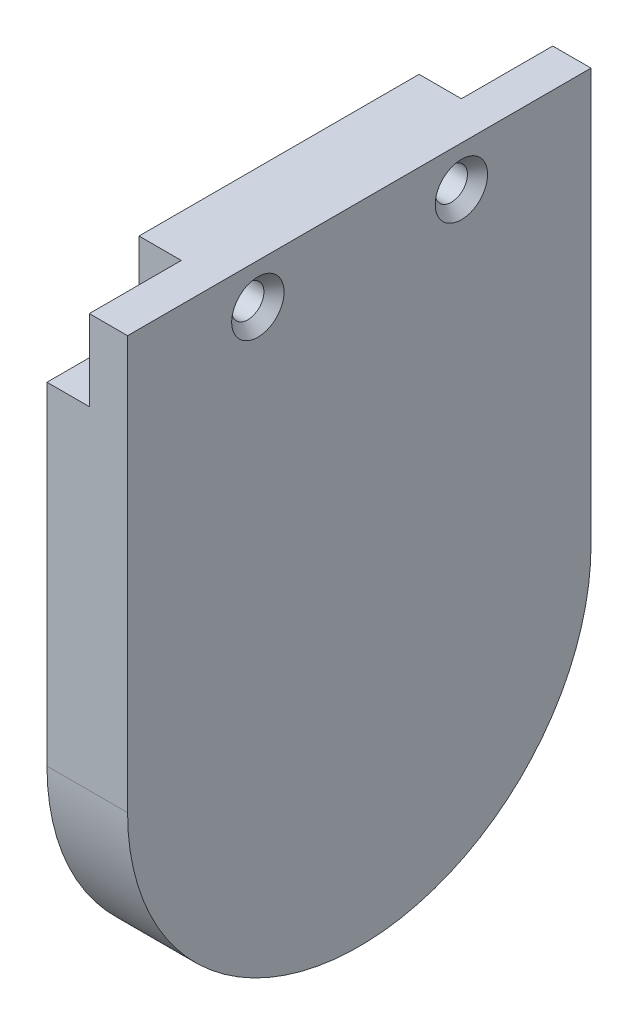
ISO-10303-21;
HEADER;
FILE_DESCRIPTION(('STEP AP214'),'2;1');
FILE_NAME('part.step','',(''),(''),'','','');
FILE_SCHEMA(('AUTOMOTIVE_DESIGN { 1 0 10303 214 1 1 1 1 }'));
ENDSEC;
DATA;
#1=APPLICATION_CONTEXT('core data for automotive mechanical design processes');
#2=APPLICATION_PROTOCOL_DEFINITION('international standard','automotive_design',2000,#1);
#3=PRODUCT_CONTEXT('',#1,'mechanical');
#4=PRODUCT('Part','Part','',(#3));
#5=PRODUCT_RELATED_PRODUCT_CATEGORY('part','',(#4));
#6=PRODUCT_DEFINITION_FORMATION('','',#4);
#7=PRODUCT_DEFINITION_CONTEXT('part definition',#1,'design');
#8=PRODUCT_DEFINITION('design','',#6,#7);
#9=PRODUCT_DEFINITION_SHAPE('','',#8);
#10=(LENGTH_UNIT() NAMED_UNIT(*) SI_UNIT(.MILLI.,.METRE.));
#11=(NAMED_UNIT(*) PLANE_ANGLE_UNIT() SI_UNIT($,.RADIAN.));
#12=(NAMED_UNIT(*) SI_UNIT($,.STERADIAN.) SOLID_ANGLE_UNIT());
#13=UNCERTAINTY_MEASURE_WITH_UNIT(LENGTH_MEASURE(1.E-05),#10,'distance_accuracy_value','');
#14=(GEOMETRIC_REPRESENTATION_CONTEXT(3) GLOBAL_UNCERTAINTY_ASSIGNED_CONTEXT((#13)) GLOBAL_UNIT_ASSIGNED_CONTEXT((#10,
#11,#12)) REPRESENTATION_CONTEXT('',''));
#15=CARTESIAN_POINT('',(0.,0.,0.));
#16=DIRECTION('',(0.,0.,1.));
#17=DIRECTION('',(1.,0.,0.));
#18=AXIS2_PLACEMENT_3D('',#15,#16,#17);
#19=CARTESIAN_POINT('',(27.75,0.,-23.));
#20=DIRECTION('',(-1.,0.,0.));
#21=DIRECTION('',(0.,0.,1.));
#22=AXIS2_PLACEMENT_3D('',#19,#20,#21);
#23=PLANE('',#22);
#24=CARTESIAN_POINT('',(27.75,4.,-10.1343003117735));
#25=DIRECTION('',(-1.,0.,0.));
#26=DIRECTION('',(0.,0.,1.));
#27=AXIS2_PLACEMENT_3D('',#24,#25,#26);
#28=CIRCLE('',#27,1.6);
#29=CARTESIAN_POINT('',(27.75,4.,-8.53430031177349));
#30=VERTEX_POINT('',#29);
#31=EDGE_CURVE('E174',#30,#30,#28,.T.);
#32=ORIENTED_EDGE('',*,*,#31,.F.);
#33=EDGE_LOOP('',(#32));
#34=FACE_BOUND('',#33,.T.);
#35=CARTESIAN_POINT('',(27.75,4.,10.0656996882265));
#36=DIRECTION('',(-1.,0.,0.));
#37=DIRECTION('',(0.,0.,1.));
#38=AXIS2_PLACEMENT_3D('',#35,#36,#37);
#39=CIRCLE('',#38,1.6);
#40=CARTESIAN_POINT('',(27.75,4.,11.6656996882265));
#41=VERTEX_POINT('',#40);
#42=EDGE_CURVE('E150',#41,#41,#39,.T.);
#43=ORIENTED_EDGE('',*,*,#42,.F.);
#44=EDGE_LOOP('',(#43));
#45=FACE_BOUND('',#44,.T.);
#46=CARTESIAN_POINT('',(27.75,-33.,0.));
#47=DIRECTION('',(1.,0.,0.));
#48=DIRECTION('',(0.,0.,-1.));
#49=AXIS2_PLACEMENT_3D('',#46,#47,#48);
#50=CIRCLE('',#49,18.6);
#51=CARTESIAN_POINT('',(27.75,-33.,-18.6));
#52=VERTEX_POINT('',#51);
#53=EDGE_CURVE('E196',#52,#52,#50,.T.);
#54=ORIENTED_EDGE('',*,*,#53,.T.);
#55=EDGE_LOOP('',(#54));
#56=FACE_BOUND('',#55,.T.);
#57=DIRECTION('',(0.,-1.,0.));
#58=VECTOR('',#57,1.);
#59=CARTESIAN_POINT('',(27.75,0.,-13.9343003117735));
#60=LINE('',#59,#58);
#61=CARTESIAN_POINT('',(27.75,8.,-13.9343003117735));
#62=VERTEX_POINT('',#61);
#63=CARTESIAN_POINT('',(27.75,0.,-13.9343003117735));
#64=VERTEX_POINT('',#63);
#65=EDGE_CURVE('E146',#62,#64,#60,.T.);
#66=ORIENTED_EDGE('',*,*,#65,.T.);
#67=DIRECTION('',(0.,0.,-1.));
#68=VECTOR('',#67,1.);
#69=CARTESIAN_POINT('',(27.75,0.,0.));
#70=LINE('',#69,#68);
#71=CARTESIAN_POINT('',(27.75,0.,-23.));
#72=VERTEX_POINT('',#71);
#73=EDGE_CURVE('E140',#64,#72,#70,.T.);
#74=ORIENTED_EDGE('',*,*,#73,.T.);
#75=DIRECTION('',(0.,1.,0.));
#76=VECTOR('',#75,1.);
#77=CARTESIAN_POINT('',(27.75,-33.,-23.));
#78=LINE('',#77,#76);
#79=CARTESIAN_POINT('',(27.75,-33.,-23.));
#80=VERTEX_POINT('',#79);
#81=EDGE_CURVE('E181',#80,#72,#78,.T.);
#82=ORIENTED_EDGE('',*,*,#81,.F.);
#83=CARTESIAN_POINT('',(27.75,-33.,0.));
#84=DIRECTION('',(-1.,0.,0.));
#85=DIRECTION('',(0.,0.,1.));
#86=AXIS2_PLACEMENT_3D('',#83,#84,#85);
#87=CIRCLE('',#86,23.);
#88=CARTESIAN_POINT('',(27.75,-33.,23.));
#89=VERTEX_POINT('',#88);
#90=EDGE_CURVE('E193',#80,#89,#87,.T.);
#91=ORIENTED_EDGE('',*,*,#90,.T.);
#92=DIRECTION('',(0.,1.,0.));
#93=VECTOR('',#92,1.);
#94=CARTESIAN_POINT('',(27.75,-33.,23.));
#95=LINE('',#94,#93);
#96=CARTESIAN_POINT('',(27.75,0.,23.));
#97=VERTEX_POINT('',#96);
#98=EDGE_CURVE('E184',#89,#97,#95,.T.);
#99=ORIENTED_EDGE('',*,*,#98,.T.);
#100=DIRECTION('',(0.,0.,1.));
#101=VECTOR('',#100,1.);
#102=CARTESIAN_POINT('',(27.75,0.,0.));
#103=LINE('',#102,#101);
#104=CARTESIAN_POINT('',(27.75,0.,13.8656996882265));
#105=VERTEX_POINT('',#104);
#106=EDGE_CURVE('E163',#105,#97,#103,.T.);
#107=ORIENTED_EDGE('',*,*,#106,.F.);
#108=DIRECTION('',(0.,1.,0.));
#109=VECTOR('',#108,1.);
#110=CARTESIAN_POINT('',(27.75,0.,13.8656996882265));
#111=LINE('',#110,#109);
#112=CARTESIAN_POINT('',(27.75,8.,13.8656996882265));
#113=VERTEX_POINT('',#112);
#114=EDGE_CURVE('E171',#105,#113,#111,.T.);
#115=ORIENTED_EDGE('',*,*,#114,.T.);
#116=DIRECTION('',(0.,0.,-1.));
#117=VECTOR('',#116,1.);
#118=CARTESIAN_POINT('',(27.75,8.,0.));
#119=LINE('',#118,#117);
#120=EDGE_CURVE('E159',#113,#62,#119,.T.);
#121=ORIENTED_EDGE('',*,*,#120,.T.);
#122=EDGE_LOOP('',(#66,#74,#82,#91,#99,#107,#115,#121));
#123=FACE_BOUND('',#122,.T.);
#124=ADVANCED_FACE('F48',(#34,#45,#56,#123),#23,.T.);
#125=CARTESIAN_POINT('',(0.,8.,0.));
#126=DIRECTION('',(0.,-1.,0.));
#127=DIRECTION('',(0.,0.,-1.));
#128=AXIS2_PLACEMENT_3D('',#125,#126,#127);
#129=PLANE('',#128);
#130=DIRECTION('',(-1.,0.,0.));
#131=VECTOR('',#130,1.);
#132=CARTESIAN_POINT('',(31.95,8.,-13.9343003117735));
#133=LINE('',#132,#131);
#134=CARTESIAN_POINT('',(31.95,8.,-13.9343003117735));
#135=VERTEX_POINT('',#134);
#136=EDGE_CURVE('E133',#135,#62,#133,.T.);
#137=ORIENTED_EDGE('',*,*,#136,.T.);
#138=ORIENTED_EDGE('',*,*,#120,.F.);
#139=DIRECTION('',(-1.,0.,0.));
#140=VECTOR('',#139,1.);
#141=CARTESIAN_POINT('',(31.95,8.,13.8656996882265));
#142=LINE('',#141,#140);
#143=CARTESIAN_POINT('',(31.95,8.,13.8656996882265));
#144=VERTEX_POINT('',#143);
#145=EDGE_CURVE('E155',#144,#113,#142,.T.);
#146=ORIENTED_EDGE('',*,*,#145,.F.);
#147=DIRECTION('',(0.,0.,-1.));
#148=VECTOR('',#147,1.);
#149=CARTESIAN_POINT('',(31.95,8.,0.));
#150=LINE('',#149,#148);
#151=CARTESIAN_POINT('',(31.95,8.,23.));
#152=VERTEX_POINT('',#151);
#153=EDGE_CURVE('E167',#152,#144,#150,.T.);
#154=ORIENTED_EDGE('',*,*,#153,.F.);
#155=DIRECTION('',(1.,0.,0.));
#156=VECTOR('',#155,1.);
#157=CARTESIAN_POINT('',(-31.75,8.,23.));
#158=LINE('',#157,#156);
#159=CARTESIAN_POINT('',(35.75,8.,23.));
#160=VERTEX_POINT('',#159);
#161=EDGE_CURVE('E217',#152,#160,#158,.T.);
#162=ORIENTED_EDGE('',*,*,#161,.T.);
#163=DIRECTION('',(0.,0.,1.));
#164=VECTOR('',#163,1.);
#165=CARTESIAN_POINT('',(35.75,8.,0.));
#166=LINE('',#165,#164);
#167=CARTESIAN_POINT('',(35.75,8.,-23.));
#168=VERTEX_POINT('',#167);
#169=EDGE_CURVE('E200',#168,#160,#166,.T.);
#170=ORIENTED_EDGE('',*,*,#169,.F.);
#171=DIRECTION('',(-1.,0.,0.));
#172=VECTOR('',#171,1.);
#173=CARTESIAN_POINT('',(-31.75,8.,-23.));
#174=LINE('',#173,#172);
#175=CARTESIAN_POINT('',(31.95,8.,-23.));
#176=VERTEX_POINT('',#175);
#177=EDGE_CURVE('E185',#168,#176,#174,.T.);
#178=ORIENTED_EDGE('',*,*,#177,.T.);
#179=DIRECTION('',(0.,0.,-1.));
#180=VECTOR('',#179,1.);
#181=CARTESIAN_POINT('',(31.95,8.,0.));
#182=LINE('',#181,#180);
#183=EDGE_CURVE('E72',#135,#176,#182,.T.);
#184=ORIENTED_EDGE('',*,*,#183,.F.);
#185=EDGE_LOOP('',(#137,#138,#146,#154,#162,#170,#178,#184));
#186=FACE_BOUND('',#185,.T.);
#187=ADVANCED_FACE('F258',(#186),#129,.F.);
#188=CARTESIAN_POINT('',(-31.75,8.,-23.));
#189=DIRECTION('',(0.,0.,1.));
#190=DIRECTION('',(1.,0.,0.));
#191=AXIS2_PLACEMENT_3D('',#188,#189,#190);
#192=PLANE('',#191);
#193=DIRECTION('',(-1.,0.,0.));
#194=VECTOR('',#193,1.);
#195=CARTESIAN_POINT('',(31.95,0.,-23.));
#196=LINE('',#195,#194);
#197=CARTESIAN_POINT('',(31.95,0.,-23.));
#198=VERTEX_POINT('',#197);
#199=EDGE_CURVE('E157',#198,#72,#196,.T.);
#200=ORIENTED_EDGE('',*,*,#199,.F.);
#201=DIRECTION('',(0.,-1.,0.));
#202=VECTOR('',#201,1.);
#203=CARTESIAN_POINT('',(31.95,0.,-23.));
#204=LINE('',#203,#202);
#205=EDGE_CURVE('E142',#176,#198,#204,.T.);
#206=ORIENTED_EDGE('',*,*,#205,.F.);
#207=ORIENTED_EDGE('',*,*,#177,.F.);
#208=DIRECTION('',(0.,1.,0.));
#209=VECTOR('',#208,1.);
#210=CARTESIAN_POINT('',(35.75,0.,-23.));
#211=LINE('',#210,#209);
#212=CARTESIAN_POINT('',(35.75,-33.,-23.));
#213=VERTEX_POINT('',#212);
#214=EDGE_CURVE('E205',#213,#168,#211,.T.);
#215=ORIENTED_EDGE('',*,*,#214,.F.);
#216=DIRECTION('',(-1.,0.,0.));
#217=VECTOR('',#216,1.);
#218=CARTESIAN_POINT('',(31.75,-33.,-23.));
#219=LINE('',#218,#217);
#220=EDGE_CURVE('E188',#213,#80,#219,.T.);
#221=ORIENTED_EDGE('',*,*,#220,.T.);
#222=ORIENTED_EDGE('',*,*,#81,.T.);
#223=EDGE_LOOP('',(#200,#206,#207,#215,#221,#222));
#224=FACE_BOUND('',#223,.T.);
#225=ADVANCED_FACE('F256',(#224),#192,.F.);
#226=CARTESIAN_POINT('',(31.75,0.,0.));
#227=DIRECTION('',(1.,0.,0.));
#228=DIRECTION('',(0.,0.,-1.));
#229=AXIS2_PLACEMENT_3D('',#226,#227,#228);
#230=PLANE('',#229);
#231=CARTESIAN_POINT('',(31.75,-33.,0.));
#232=DIRECTION('',(1.,0.,0.));
#233=DIRECTION('',(0.,0.,-1.));
#234=AXIS2_PLACEMENT_3D('',#231,#232,#233);
#235=CIRCLE('',#234,18.6);
#236=CARTESIAN_POINT('',(31.75,-33.,-18.6));
#237=VERTEX_POINT('',#236);
#238=EDGE_CURVE('E197',#237,#237,#235,.T.);
#239=ORIENTED_EDGE('',*,*,#238,.F.);
#240=EDGE_LOOP('',(#239));
#241=FACE_BOUND('',#240,.T.);
#242=ADVANCED_FACE('F291',(#241),#230,.F.);
#243=CARTESIAN_POINT('',(27.75,-33.,0.));
#244=DIRECTION('',(1.,0.,0.));
#245=DIRECTION('',(0.,0.,-1.));
#246=AXIS2_PLACEMENT_3D('',#243,#244,#245);
#247=CYLINDRICAL_SURFACE('',#246,18.6);
#248=ORIENTED_EDGE('',*,*,#53,.F.);
#249=EDGE_LOOP('',(#248));
#250=FACE_BOUND('',#249,.T.);
#251=ORIENTED_EDGE('',*,*,#238,.T.);
#252=EDGE_LOOP('',(#251));
#253=FACE_BOUND('',#252,.T.);
#254=ADVANCED_FACE('F293',(#250,#253),#247,.F.);
#255=CARTESIAN_POINT('',(-31.75,8.,23.));
#256=DIRECTION('',(0.,0.,-1.));
#257=DIRECTION('',(-1.,0.,0.));
#258=AXIS2_PLACEMENT_3D('',#255,#256,#257);
#259=PLANE('',#258);
#260=DIRECTION('',(0.,1.,0.));
#261=VECTOR('',#260,1.);
#262=CARTESIAN_POINT('',(31.95,0.,23.));
#263=LINE('',#262,#261);
#264=CARTESIAN_POINT('',(31.95,0.,23.));
#265=VERTEX_POINT('',#264);
#266=EDGE_CURVE('E165',#265,#152,#263,.T.);
#267=ORIENTED_EDGE('',*,*,#266,.F.);
#268=DIRECTION('',(-1.,0.,0.));
#269=VECTOR('',#268,1.);
#270=CARTESIAN_POINT('',(31.95,0.,23.));
#271=LINE('',#270,#269);
#272=EDGE_CURVE('E177',#265,#97,#271,.T.);
#273=ORIENTED_EDGE('',*,*,#272,.T.);
#274=ORIENTED_EDGE('',*,*,#98,.F.);
#275=DIRECTION('',(1.,0.,0.));
#276=VECTOR('',#275,1.);
#277=CARTESIAN_POINT('',(27.75,-33.,23.));
#278=LINE('',#277,#276);
#279=CARTESIAN_POINT('',(35.75,-33.,23.));
#280=VERTEX_POINT('',#279);
#281=EDGE_CURVE('E191',#89,#280,#278,.T.);
#282=ORIENTED_EDGE('',*,*,#281,.T.);
#283=DIRECTION('',(0.,-1.,0.));
#284=VECTOR('',#283,1.);
#285=CARTESIAN_POINT('',(35.75,0.,23.));
#286=LINE('',#285,#284);
#287=EDGE_CURVE('E211',#160,#280,#286,.T.);
#288=ORIENTED_EDGE('',*,*,#287,.F.);
#289=ORIENTED_EDGE('',*,*,#161,.F.);
#290=EDGE_LOOP('',(#267,#273,#274,#282,#288,#289));
#291=FACE_BOUND('',#290,.T.);
#292=ADVANCED_FACE('F241',(#291),#259,.F.);
#293=CARTESIAN_POINT('',(35.75,0.,0.));
#294=DIRECTION('',(1.,0.,0.));
#295=DIRECTION('',(0.,0.,-1.));
#296=AXIS2_PLACEMENT_3D('',#293,#294,#295);
#297=PLANE('',#296);
#298=CARTESIAN_POINT('',(35.75,4.,10.0656996882265));
#299=DIRECTION('',(1.,0.,0.));
#300=DIRECTION('',(0.,0.,-1.));
#301=AXIS2_PLACEMENT_3D('',#298,#299,#300);
#302=CIRCLE('',#301,2.60000000000001);
#303=CARTESIAN_POINT('',(35.75,4.,7.4656996882265));
#304=VERTEX_POINT('',#303);
#305=EDGE_CURVE('E223',#304,#304,#302,.F.);
#306=ORIENTED_EDGE('',*,*,#305,.T.);
#307=EDGE_LOOP('',(#306));
#308=FACE_BOUND('',#307,.T.);
#309=CARTESIAN_POINT('',(35.75,4.,-10.1343003117735));
#310=DIRECTION('',(1.,0.,0.));
#311=DIRECTION('',(0.,0.,-1.));
#312=AXIS2_PLACEMENT_3D('',#309,#310,#311);
#313=CIRCLE('',#312,2.6);
#314=CARTESIAN_POINT('',(35.75,4.,-12.7343003117735));
#315=VERTEX_POINT('',#314);
#316=EDGE_CURVE('E214',#315,#315,#313,.F.);
#317=ORIENTED_EDGE('',*,*,#316,.T.);
#318=EDGE_LOOP('',(#317));
#319=FACE_BOUND('',#318,.T.);
#320=ORIENTED_EDGE('',*,*,#287,.T.);
#321=CARTESIAN_POINT('',(35.75,-33.,0.));
#322=DIRECTION('',(1.,0.,0.));
#323=DIRECTION('',(0.,0.,-1.));
#324=AXIS2_PLACEMENT_3D('',#321,#322,#323);
#325=CIRCLE('',#324,23.);
#326=EDGE_CURVE('E208',#280,#213,#325,.T.);
#327=ORIENTED_EDGE('',*,*,#326,.T.);
#328=ORIENTED_EDGE('',*,*,#214,.T.);
#329=ORIENTED_EDGE('',*,*,#169,.T.);
#330=EDGE_LOOP('',(#320,#327,#328,#329));
#331=FACE_BOUND('',#330,.T.);
#332=ADVANCED_FACE('F237',(#308,#319,#331),#297,.T.);
#333=CARTESIAN_POINT('',(27.75,-33.,0.));
#334=DIRECTION('',(1.,0.,0.));
#335=DIRECTION('',(0.,0.,1.));
#336=AXIS2_PLACEMENT_3D('',#333,#334,#335);
#337=CYLINDRICAL_SURFACE('',#336,23.);
#338=ORIENTED_EDGE('',*,*,#90,.F.);
#339=ORIENTED_EDGE('',*,*,#220,.F.);
#340=ORIENTED_EDGE('',*,*,#326,.F.);
#341=ORIENTED_EDGE('',*,*,#281,.F.);
#342=EDGE_LOOP('',(#338,#339,#340,#341));
#343=FACE_BOUND('',#342,.T.);
#344=ADVANCED_FACE('F240',(#343),#337,.T.);
#345=CARTESIAN_POINT('',(31.95,0.,0.));
#346=DIRECTION('',(0.,1.,0.));
#347=DIRECTION('',(0.,0.,1.));
#348=AXIS2_PLACEMENT_3D('',#345,#346,#347);
#349=PLANE('',#348);
#350=ORIENTED_EDGE('',*,*,#73,.F.);
#351=DIRECTION('',(-1.,0.,0.));
#352=VECTOR('',#351,1.);
#353=CARTESIAN_POINT('',(31.95,0.,-13.9343003117735));
#354=LINE('',#353,#352);
#355=CARTESIAN_POINT('',(31.95,0.,-13.9343003117735));
#356=VERTEX_POINT('',#355);
#357=EDGE_CURVE('E130',#356,#64,#354,.T.);
#358=ORIENTED_EDGE('',*,*,#357,.F.);
#359=DIRECTION('',(0.,0.,-1.));
#360=VECTOR('',#359,1.);
#361=CARTESIAN_POINT('',(31.95,0.,0.));
#362=LINE('',#361,#360);
#363=EDGE_CURVE('E135',#356,#198,#362,.T.);
#364=ORIENTED_EDGE('',*,*,#363,.T.);
#365=ORIENTED_EDGE('',*,*,#199,.T.);
#366=EDGE_LOOP('',(#350,#358,#364,#365));
#367=FACE_BOUND('',#366,.T.);
#368=ADVANCED_FACE('F138',(#367),#349,.T.);
#369=CARTESIAN_POINT('',(31.95,0.,-13.9343003117735));
#370=DIRECTION('',(0.,0.,-1.));
#371=DIRECTION('',(-1.,0.,0.));
#372=AXIS2_PLACEMENT_3D('',#369,#370,#371);
#373=PLANE('',#372);
#374=ORIENTED_EDGE('',*,*,#65,.F.);
#375=ORIENTED_EDGE('',*,*,#136,.F.);
#376=DIRECTION('',(0.,-1.,0.));
#377=VECTOR('',#376,1.);
#378=CARTESIAN_POINT('',(31.95,0.,-13.9343003117735));
#379=LINE('',#378,#377);
#380=EDGE_CURVE('E127',#135,#356,#379,.T.);
#381=ORIENTED_EDGE('',*,*,#380,.T.);
#382=ORIENTED_EDGE('',*,*,#357,.T.);
#383=EDGE_LOOP('',(#374,#375,#381,#382));
#384=FACE_BOUND('',#383,.T.);
#385=ADVANCED_FACE('F129',(#384),#373,.T.);
#386=CARTESIAN_POINT('',(31.95,0.,0.));
#387=DIRECTION('',(-1.,0.,0.));
#388=DIRECTION('',(0.,0.,1.));
#389=AXIS2_PLACEMENT_3D('',#386,#387,#388);
#390=PLANE('',#389);
#391=ORIENTED_EDGE('',*,*,#363,.F.);
#392=ORIENTED_EDGE('',*,*,#380,.F.);
#393=ORIENTED_EDGE('',*,*,#183,.T.);
#394=ORIENTED_EDGE('',*,*,#205,.T.);
#395=EDGE_LOOP('',(#391,#392,#393,#394));
#396=FACE_BOUND('',#395,.T.);
#397=ADVANCED_FACE('F144',(#396),#390,.T.);
#398=CARTESIAN_POINT('',(31.95,0.,13.8656996882265));
#399=DIRECTION('',(0.,0.,1.));
#400=DIRECTION('',(1.,0.,0.));
#401=AXIS2_PLACEMENT_3D('',#398,#399,#400);
#402=PLANE('',#401);
#403=ORIENTED_EDGE('',*,*,#114,.F.);
#404=DIRECTION('',(-1.,0.,0.));
#405=VECTOR('',#404,1.);
#406=CARTESIAN_POINT('',(31.95,0.,13.8656996882265));
#407=LINE('',#406,#405);
#408=CARTESIAN_POINT('',(31.95,0.,13.8656996882265));
#409=VERTEX_POINT('',#408);
#410=EDGE_CURVE('E170',#409,#105,#407,.T.);
#411=ORIENTED_EDGE('',*,*,#410,.F.);
#412=DIRECTION('',(0.,1.,0.));
#413=VECTOR('',#412,1.);
#414=CARTESIAN_POINT('',(31.95,0.,13.8656996882265));
#415=LINE('',#414,#413);
#416=EDGE_CURVE('E161',#409,#144,#415,.T.);
#417=ORIENTED_EDGE('',*,*,#416,.T.);
#418=ORIENTED_EDGE('',*,*,#145,.T.);
#419=EDGE_LOOP('',(#403,#411,#417,#418));
#420=FACE_BOUND('',#419,.T.);
#421=ADVANCED_FACE('F268',(#420),#402,.T.);
#422=CARTESIAN_POINT('',(31.95,0.,0.));
#423=DIRECTION('',(0.,-1.,0.));
#424=DIRECTION('',(0.,0.,-1.));
#425=AXIS2_PLACEMENT_3D('',#422,#423,#424);
#426=PLANE('',#425);
#427=ORIENTED_EDGE('',*,*,#106,.T.);
#428=ORIENTED_EDGE('',*,*,#272,.F.);
#429=DIRECTION('',(0.,0.,1.));
#430=VECTOR('',#429,1.);
#431=CARTESIAN_POINT('',(31.95,0.,0.));
#432=LINE('',#431,#430);
#433=EDGE_CURVE('E64',#409,#265,#432,.T.);
#434=ORIENTED_EDGE('',*,*,#433,.F.);
#435=ORIENTED_EDGE('',*,*,#410,.T.);
#436=EDGE_LOOP('',(#427,#428,#434,#435));
#437=FACE_BOUND('',#436,.T.);
#438=ADVANCED_FACE('F269',(#437),#426,.F.);
#439=CARTESIAN_POINT('',(31.95,0.,0.));
#440=DIRECTION('',(-1.,0.,0.));
#441=DIRECTION('',(0.,0.,1.));
#442=AXIS2_PLACEMENT_3D('',#439,#440,#441);
#443=PLANE('',#442);
#444=ORIENTED_EDGE('',*,*,#416,.F.);
#445=ORIENTED_EDGE('',*,*,#433,.T.);
#446=ORIENTED_EDGE('',*,*,#266,.T.);
#447=ORIENTED_EDGE('',*,*,#153,.T.);
#448=EDGE_LOOP('',(#444,#445,#446,#447));
#449=FACE_BOUND('',#448,.T.);
#450=ADVANCED_FACE('F262',(#449),#443,.T.);
#451=CARTESIAN_POINT('',(35.75,4.,10.0656996882265));
#452=DIRECTION('',(-1.,0.,0.));
#453=DIRECTION('',(0.,0.,1.));
#454=AXIS2_PLACEMENT_3D('',#451,#452,#453);
#455=CYLINDRICAL_SURFACE('',#454,1.6);
#456=CARTESIAN_POINT('',(34.75,4.,10.0656996882265));
#457=DIRECTION('',(1.,0.,0.));
#458=DIRECTION('',(0.,0.,-1.));
#459=AXIS2_PLACEMENT_3D('',#456,#457,#458);
#460=CIRCLE('',#459,1.6);
#461=CARTESIAN_POINT('',(34.75,4.,8.46569968822651));
#462=VERTEX_POINT('',#461);
#463=EDGE_CURVE('E57',#462,#462,#460,.T.);
#464=ORIENTED_EDGE('',*,*,#463,.T.);
#465=EDGE_LOOP('',(#464));
#466=FACE_BOUND('',#465,.T.);
#467=ORIENTED_EDGE('',*,*,#42,.T.);
#468=EDGE_LOOP('',(#467));
#469=FACE_BOUND('',#468,.T.);
#470=ADVANCED_FACE('F228',(#466,#469),#455,.F.);
#471=CARTESIAN_POINT('',(35.75,4.,-10.1343003117735));
#472=DIRECTION('',(-1.,0.,0.));
#473=DIRECTION('',(0.,0.,1.));
#474=AXIS2_PLACEMENT_3D('',#471,#472,#473);
#475=CYLINDRICAL_SURFACE('',#474,1.6);
#476=CARTESIAN_POINT('',(34.75,4.,-10.1343003117735));
#477=DIRECTION('',(1.,0.,0.));
#478=DIRECTION('',(0.,0.,-1.));
#479=AXIS2_PLACEMENT_3D('',#476,#477,#478);
#480=CIRCLE('',#479,1.6);
#481=CARTESIAN_POINT('',(34.75,4.,-11.7343003117735));
#482=VERTEX_POINT('',#481);
#483=EDGE_CURVE('E11',#482,#482,#480,.T.);
#484=ORIENTED_EDGE('',*,*,#483,.T.);
#485=EDGE_LOOP('',(#484));
#486=FACE_BOUND('',#485,.T.);
#487=ORIENTED_EDGE('',*,*,#31,.T.);
#488=EDGE_LOOP('',(#487));
#489=FACE_BOUND('',#488,.T.);
#490=ADVANCED_FACE('F234',(#486,#489),#475,.F.);
#491=CARTESIAN_POINT('',(35.75,4.,10.0656996882265));
#492=DIRECTION('',(1.,0.,0.));
#493=DIRECTION('',(0.,0.,-1.));
#494=AXIS2_PLACEMENT_3D('',#491,#492,#493);
#495=CONICAL_SURFACE('',#494,2.60000000000001,0.785398163397447);
#496=ORIENTED_EDGE('',*,*,#463,.F.);
#497=EDGE_LOOP('',(#496));
#498=FACE_BOUND('',#497,.T.);
#499=ORIENTED_EDGE('',*,*,#305,.F.);
#500=EDGE_LOOP('',(#499));
#501=FACE_BOUND('',#500,.T.);
#502=ADVANCED_FACE('F231',(#498,#501),#495,.F.);
#503=CARTESIAN_POINT('',(35.75,4.,-10.1343003117735));
#504=DIRECTION('',(1.,0.,0.));
#505=DIRECTION('',(0.,0.,-1.));
#506=AXIS2_PLACEMENT_3D('',#503,#504,#505);
#507=CONICAL_SURFACE('',#506,2.6,0.785398163397446);
#508=ORIENTED_EDGE('',*,*,#483,.F.);
#509=EDGE_LOOP('',(#508));
#510=FACE_BOUND('',#509,.T.);
#511=ORIENTED_EDGE('',*,*,#316,.F.);
#512=EDGE_LOOP('',(#511));
#513=FACE_BOUND('',#512,.T.);
#514=ADVANCED_FACE('F51',(#510,#513),#507,.F.);
#515=CLOSED_SHELL('',(#124,#187,#225,#242,#254,#292,#332,#344,#368,#385,#397,#421,#438,#450,
#470,#490,#502,#514));
#516=MANIFOLD_SOLID_BREP('B2',#515);
#517=ADVANCED_BREP_SHAPE_REPRESENTATION('',(#18,#516),#14);
#518=SHAPE_DEFINITION_REPRESENTATION(#9,#517);
ENDSEC;
END-ISO-10303-21;
